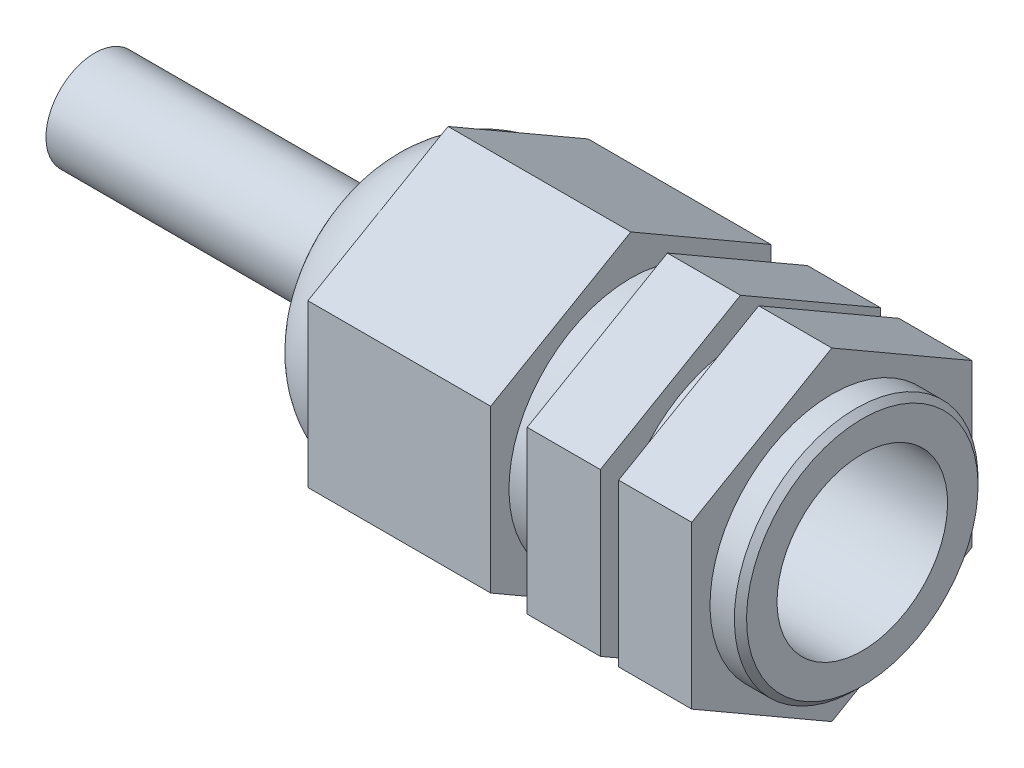
ISO-10303-21;
HEADER;
FILE_DESCRIPTION(('STEP AP214'),'2;1');
FILE_NAME('part.step','',(''),(''),'','','');
FILE_SCHEMA(('AUTOMOTIVE_DESIGN { 1 0 10303 214 1 1 1 1 }'));
ENDSEC;
DATA;
#1=APPLICATION_CONTEXT('core data for automotive mechanical design processes');
#2=APPLICATION_PROTOCOL_DEFINITION('international standard','automotive_design',2000,#1);
#3=PRODUCT_CONTEXT('',#1,'mechanical');
#4=PRODUCT('Part','Part','',(#3));
#5=PRODUCT_RELATED_PRODUCT_CATEGORY('part','',(#4));
#6=PRODUCT_DEFINITION_FORMATION('','',#4);
#7=PRODUCT_DEFINITION_CONTEXT('part definition',#1,'design');
#8=PRODUCT_DEFINITION('design','',#6,#7);
#9=PRODUCT_DEFINITION_SHAPE('','',#8);
#10=(LENGTH_UNIT() NAMED_UNIT(*) SI_UNIT(.MILLI.,.METRE.));
#11=(NAMED_UNIT(*) PLANE_ANGLE_UNIT() SI_UNIT($,.RADIAN.));
#12=(NAMED_UNIT(*) SI_UNIT($,.STERADIAN.) SOLID_ANGLE_UNIT());
#13=UNCERTAINTY_MEASURE_WITH_UNIT(LENGTH_MEASURE(1.E-05),#10,'distance_accuracy_value','');
#14=(GEOMETRIC_REPRESENTATION_CONTEXT(3) GLOBAL_UNCERTAINTY_ASSIGNED_CONTEXT((#13)) GLOBAL_UNIT_ASSIGNED_CONTEXT((#10,
#11,#12)) REPRESENTATION_CONTEXT('',''));
#15=CARTESIAN_POINT('',(0.,0.,0.));
#16=DIRECTION('',(0.,0.,1.));
#17=DIRECTION('',(1.,0.,0.));
#18=AXIS2_PLACEMENT_3D('',#15,#16,#17);
#19=CARTESIAN_POINT('',(-23.,0.,0.));
#20=DIRECTION('',(1.,0.,0.));
#21=DIRECTION('',(0.,1.,0.));
#22=AXIS2_PLACEMENT_3D('',#19,#20,#21);
#23=CYLINDRICAL_SURFACE('',#22,4.);
#24=CARTESIAN_POINT('',(-23.,0.,0.));
#25=DIRECTION('',(1.,0.,0.));
#26=DIRECTION('',(0.,1.,0.));
#27=AXIS2_PLACEMENT_3D('',#24,#25,#26);
#28=CIRCLE('',#27,4.);
#29=CARTESIAN_POINT('',(-23.,4.,0.));
#30=VERTEX_POINT('',#29);
#31=EDGE_CURVE('E11',#30,#30,#28,.T.);
#32=CARTESIAN_POINT('',(5.,0.,0.));
#33=DIRECTION('',(1.,0.,0.));
#34=DIRECTION('',(0.,1.,0.));
#35=AXIS2_PLACEMENT_3D('',#32,#33,#34);
#36=CIRCLE('',#35,4.);
#37=CARTESIAN_POINT('',(5.,4.,0.));
#38=VERTEX_POINT('',#37);
#39=EDGE_CURVE('E47',#38,#38,#36,.T.);
#40=CARTESIAN_POINT('',(-23.,4.,0.));
#41=CARTESIAN_POINT('',(-22.7083333333333,4.,0.));
#42=CARTESIAN_POINT('',(-22.4166666666667,4.,0.));
#43=CARTESIAN_POINT('',(-21.8333333333333,4.,0.));
#44=CARTESIAN_POINT('',(-21.5416666666667,4.,0.));
#45=CARTESIAN_POINT('',(-20.9583333333333,4.,0.));
#46=CARTESIAN_POINT('',(-20.6666666666667,4.,0.));
#47=CARTESIAN_POINT('',(-20.0833333333333,4.,0.));
#48=CARTESIAN_POINT('',(-19.7916666666667,4.,0.));
#49=CARTESIAN_POINT('',(-19.2083333333333,4.,0.));
#50=CARTESIAN_POINT('',(-18.9166666666667,4.,0.));
#51=CARTESIAN_POINT('',(-18.3333333333333,4.,0.));
#52=CARTESIAN_POINT('',(-18.0416666666667,4.,0.));
#53=CARTESIAN_POINT('',(-17.4583333333333,4.,0.));
#54=CARTESIAN_POINT('',(-17.1666666666667,4.,0.));
#55=CARTESIAN_POINT('',(-16.5833333333333,4.,0.));
#56=CARTESIAN_POINT('',(-16.2916666666667,4.,0.));
#57=CARTESIAN_POINT('',(-15.7083333333333,4.,0.));
#58=CARTESIAN_POINT('',(-15.4166666666667,4.,0.));
#59=CARTESIAN_POINT('',(-14.8333333333333,4.,0.));
#60=CARTESIAN_POINT('',(-14.5416666666667,4.,0.));
#61=CARTESIAN_POINT('',(-13.9583333333333,4.,0.));
#62=CARTESIAN_POINT('',(-13.6666666666667,4.,0.));
#63=CARTESIAN_POINT('',(-13.0833333333333,4.,0.));
#64=CARTESIAN_POINT('',(-12.7916666666667,4.,0.));
#65=CARTESIAN_POINT('',(-12.2083333333333,4.,0.));
#66=CARTESIAN_POINT('',(-11.9166666666667,4.,0.));
#67=CARTESIAN_POINT('',(-11.3333333333333,4.,0.));
#68=CARTESIAN_POINT('',(-11.0416666666667,4.,0.));
#69=CARTESIAN_POINT('',(-10.4583333333333,4.,0.));
#70=CARTESIAN_POINT('',(-10.1666666666667,4.,0.));
#71=CARTESIAN_POINT('',(-9.58333333333333,4.,0.));
#72=CARTESIAN_POINT('',(-9.29166666666666,4.,0.));
#73=CARTESIAN_POINT('',(-8.70833333333333,4.,0.));
#74=CARTESIAN_POINT('',(-8.41666666666666,4.,0.));
#75=CARTESIAN_POINT('',(-7.83333333333333,4.,0.));
#76=CARTESIAN_POINT('',(-7.54166666666667,4.,0.));
#77=CARTESIAN_POINT('',(-6.95833333333333,4.,0.));
#78=CARTESIAN_POINT('',(-6.66666666666667,4.,0.));
#79=CARTESIAN_POINT('',(-6.08333333333334,4.,0.));
#80=CARTESIAN_POINT('',(-5.79166666666667,4.,0.));
#81=CARTESIAN_POINT('',(-5.20833333333333,4.,0.));
#82=CARTESIAN_POINT('',(-4.91666666666667,4.,0.));
#83=CARTESIAN_POINT('',(-4.33333333333333,4.,0.));
#84=CARTESIAN_POINT('',(-4.04166666666667,4.,0.));
#85=CARTESIAN_POINT('',(-3.45833333333334,4.,0.));
#86=CARTESIAN_POINT('',(-3.16666666666667,4.,0.));
#87=CARTESIAN_POINT('',(-2.58333333333334,4.,0.));
#88=CARTESIAN_POINT('',(-2.29166666666667,4.,0.));
#89=CARTESIAN_POINT('',(-1.70833333333333,4.,0.));
#90=CARTESIAN_POINT('',(-1.41666666666667,4.,0.));
#91=CARTESIAN_POINT('',(-0.833333333333334,4.,0.));
#92=CARTESIAN_POINT('',(-0.541666666666667,4.,0.));
#93=CARTESIAN_POINT('',(0.0416666666666655,4.,0.));
#94=CARTESIAN_POINT('',(0.333333333333331,4.,0.));
#95=CARTESIAN_POINT('',(0.916666666666664,4.,0.));
#96=CARTESIAN_POINT('',(1.20833333333333,4.,0.));
#97=CARTESIAN_POINT('',(1.79166666666666,4.,0.));
#98=CARTESIAN_POINT('',(2.08333333333333,4.,0.));
#99=CARTESIAN_POINT('',(2.66666666666666,4.,0.));
#100=CARTESIAN_POINT('',(2.95833333333333,4.,0.));
#101=CARTESIAN_POINT('',(3.54166666666666,4.,0.));
#102=CARTESIAN_POINT('',(3.83333333333333,4.,0.));
#103=CARTESIAN_POINT('',(4.41666666666666,4.,0.));
#104=CARTESIAN_POINT('',(4.70833333333333,4.,0.));
#105=CARTESIAN_POINT('',(5.,4.,0.));
#106=B_SPLINE_CURVE_WITH_KNOTS('',3,(#40,#41,#42,#43,#44,#45,#46,#47,#48,#49,#50,#51,#52,#53,
#54,#55,#56,#57,#58,#59,#60,#61,#62,#63,#64,#65,#66,#67,#68,#69,#70,#71,#72,#73,#74,#75,#76,#77,
#78,#79,#80,#81,#82,#83,#84,#85,#86,#87,#88,#89,#90,#91,#92,#93,#94,#95,#96,#97,#98,#99,#100,
#101,#102,#103,#104,#105),.UNSPECIFIED.,.F.,.F.,(4,2,2,2,2,2,2,2,2,2,2,2,2,2,2,2,2,2,2,2,2,2,2,
2,2,2,2,2,2,2,2,2,4),(0.,0.875000000000001,1.75,2.625,3.5,4.375,5.25,6.125,7.,7.875,8.75,9.625,
10.5,11.375,12.25,13.125,14.,14.875,15.75,16.625,17.5,18.375,19.25,20.125,21.,21.875,22.75,
23.625,24.5,25.375,26.25,27.125,28.),.UNSPECIFIED.);
#107=EDGE_CURVE('BSEAM44',#30,#38,#106,.T.);
#108=ORIENTED_EDGE('',*,*,#31,.T.);
#109=ORIENTED_EDGE('',*,*,#39,.F.);
#110=ORIENTED_EDGE('',*,*,#107,.T.);
#111=ORIENTED_EDGE('',*,*,#107,.F.);
#112=EDGE_LOOP('',(#108,#110,#109,#111));
#113=FACE_BOUND('',#112,.T.);
#114=ADVANCED_FACE('F44',(#113),#23,.T.);
#115=CARTESIAN_POINT('',(-23.,0.,0.));
#116=DIRECTION('',(1.,0.,0.));
#117=DIRECTION('',(0.,1.,0.));
#118=AXIS2_PLACEMENT_3D('',#115,#116,#117);
#119=PLANE('',#118);
#120=ORIENTED_EDGE('',*,*,#31,.F.);
#121=EDGE_LOOP('',(#120));
#122=FACE_BOUND('',#121,.T.);
#123=ADVANCED_FACE('F59',(#122),#119,.F.);
#124=CARTESIAN_POINT('',(5.,0.,0.));
#125=DIRECTION('',(1.,0.,0.));
#126=DIRECTION('',(0.,1.,0.));
#127=AXIS2_PLACEMENT_3D('',#124,#125,#126);
#128=PLANE('',#127);
#129=ORIENTED_EDGE('',*,*,#39,.T.);
#130=EDGE_LOOP('',(#129));
#131=FACE_BOUND('',#130,.T.);
#132=ADVANCED_FACE('F56',(#131),#128,.T.);
#133=CLOSED_SHELL('',(#114,#123,#132));
#134=MANIFOLD_SOLID_BREP('B2',#133);
#135=CARTESIAN_POINT('',(37.5,13.2790561913614,0.));
#136=DIRECTION('',(1.,0.,0.));
#137=DIRECTION('',(0.,0.,-1.));
#138=AXIS2_PLACEMENT_3D('',#135,#136,#137);
#139=PLANE('',#138);
#140=DIRECTION('',(0.,0.5,0.866025403784439));
#141=VECTOR('',#140,1.);
#142=CARTESIAN_POINT('',(37.5,6.6395280956807,-11.5));
#143=LINE('',#142,#141);
#144=CARTESIAN_POINT('',(37.5,6.6395280956807,-11.5));
#145=VERTEX_POINT('',#144);
#146=CARTESIAN_POINT('',(37.5,13.2790561913614,0.));
#147=VERTEX_POINT('',#146);
#148=EDGE_CURVE('E189',#145,#147,#143,.T.);
#149=ORIENTED_EDGE('',*,*,#148,.T.);
#150=DIRECTION('',(0.,-0.500000000000001,0.866025403784438));
#151=VECTOR('',#150,1.);
#152=CARTESIAN_POINT('',(37.5,13.2790561913614,0.));
#153=LINE('',#152,#151);
#154=CARTESIAN_POINT('',(37.5,6.63952809568069,11.5));
#155=VERTEX_POINT('',#154);
#156=EDGE_CURVE('E147',#147,#155,#153,.T.);
#157=ORIENTED_EDGE('',*,*,#156,.T.);
#158=DIRECTION('',(0.,-1.,0.));
#159=VECTOR('',#158,1.);
#160=CARTESIAN_POINT('',(37.5,6.63952809568069,11.5));
#161=LINE('',#160,#159);
#162=CARTESIAN_POINT('',(37.5,-6.63952809568069,11.5));
#163=VERTEX_POINT('',#162);
#164=EDGE_CURVE('E160',#155,#163,#161,.T.);
#165=ORIENTED_EDGE('',*,*,#164,.T.);
#166=DIRECTION('',(0.,-0.5,-0.866025403784439));
#167=VECTOR('',#166,1.);
#168=CARTESIAN_POINT('',(37.5,-6.63952809568069,11.5));
#169=LINE('',#168,#167);
#170=CARTESIAN_POINT('',(37.5,-13.2790561913614,0.));
#171=VERTEX_POINT('',#170);
#172=EDGE_CURVE('E154',#163,#171,#169,.T.);
#173=ORIENTED_EDGE('',*,*,#172,.T.);
#174=DIRECTION('',(0.,0.5,-0.866025403784438));
#175=VECTOR('',#174,1.);
#176=CARTESIAN_POINT('',(37.5,-13.2790561913614,0.));
#177=LINE('',#176,#175);
#178=CARTESIAN_POINT('',(37.5,-6.63952809568069,-11.5));
#179=VERTEX_POINT('',#178);
#180=EDGE_CURVE('E158',#171,#179,#177,.T.);
#181=ORIENTED_EDGE('',*,*,#180,.T.);
#182=DIRECTION('',(0.,1.,0.));
#183=VECTOR('',#182,1.);
#184=CARTESIAN_POINT('',(37.5,-6.63952809568069,-11.5));
#185=LINE('',#184,#183);
#186=EDGE_CURVE('E110',#179,#145,#185,.T.);
#187=ORIENTED_EDGE('',*,*,#186,.T.);
#188=EDGE_LOOP('',(#149,#157,#165,#173,#181,#187));
#189=FACE_BOUND('',#188,.T.);
#190=CARTESIAN_POINT('',(37.5,0.,0.));
#191=DIRECTION('',(1.,0.,0.));
#192=DIRECTION('',(0.,1.,0.));
#193=AXIS2_PLACEMENT_3D('',#190,#191,#192);
#194=CIRCLE('',#193,9.99999999999999);
#195=CARTESIAN_POINT('',(37.5,9.99999999999999,0.));
#196=VERTEX_POINT('',#195);
#197=EDGE_CURVE('E182',#196,#196,#194,.T.);
#198=ORIENTED_EDGE('',*,*,#197,.F.);
#199=EDGE_LOOP('',(#198));
#200=FACE_BOUND('',#199,.T.);
#201=ADVANCED_FACE('F93',(#189,#200),#139,.T.);
#202=CARTESIAN_POINT('',(31.5,13.2790561913614,0.));
#203=DIRECTION('',(1.,0.,0.));
#204=DIRECTION('',(0.,0.,-1.));
#205=AXIS2_PLACEMENT_3D('',#202,#203,#204);
#206=PLANE('',#205);
#207=DIRECTION('',(0.,0.5,0.866025403784439));
#208=VECTOR('',#207,1.);
#209=CARTESIAN_POINT('',(31.5,6.6395280956807,-11.5));
#210=LINE('',#209,#208);
#211=CARTESIAN_POINT('',(31.5,6.6395280956807,-11.5));
#212=VERTEX_POINT('',#211);
#213=CARTESIAN_POINT('',(31.5,13.2790561913614,0.));
#214=VERTEX_POINT('',#213);
#215=EDGE_CURVE('E178',#212,#214,#210,.T.);
#216=ORIENTED_EDGE('',*,*,#215,.F.);
#217=DIRECTION('',(0.,1.,0.));
#218=VECTOR('',#217,1.);
#219=CARTESIAN_POINT('',(31.5,-6.63952809568069,-11.5));
#220=LINE('',#219,#218);
#221=CARTESIAN_POINT('',(31.5,-6.63952809568069,-11.5));
#222=VERTEX_POINT('',#221);
#223=EDGE_CURVE('E139',#222,#212,#220,.T.);
#224=ORIENTED_EDGE('',*,*,#223,.F.);
#225=DIRECTION('',(0.,0.5,-0.866025403784438));
#226=VECTOR('',#225,1.);
#227=CARTESIAN_POINT('',(31.5,-13.2790561913614,0.));
#228=LINE('',#227,#226);
#229=CARTESIAN_POINT('',(31.5,-13.2790561913614,0.));
#230=VERTEX_POINT('',#229);
#231=EDGE_CURVE('E133',#230,#222,#228,.T.);
#232=ORIENTED_EDGE('',*,*,#231,.F.);
#233=DIRECTION('',(0.,-0.5,-0.866025403784439));
#234=VECTOR('',#233,1.);
#235=CARTESIAN_POINT('',(31.5,-6.63952809568069,11.5));
#236=LINE('',#235,#234);
#237=CARTESIAN_POINT('',(31.5,-6.63952809568069,11.5));
#238=VERTEX_POINT('',#237);
#239=EDGE_CURVE('E168',#238,#230,#236,.T.);
#240=ORIENTED_EDGE('',*,*,#239,.F.);
#241=DIRECTION('',(0.,-1.,0.));
#242=VECTOR('',#241,1.);
#243=CARTESIAN_POINT('',(31.5,6.63952809568069,11.5));
#244=LINE('',#243,#242);
#245=CARTESIAN_POINT('',(31.5,6.63952809568069,11.5));
#246=VERTEX_POINT('',#245);
#247=EDGE_CURVE('E184',#246,#238,#244,.T.);
#248=ORIENTED_EDGE('',*,*,#247,.F.);
#249=DIRECTION('',(0.,-0.500000000000001,0.866025403784438));
#250=VECTOR('',#249,1.);
#251=CARTESIAN_POINT('',(31.5,13.2790561913614,0.));
#252=LINE('',#251,#250);
#253=EDGE_CURVE('E181',#214,#246,#252,.T.);
#254=ORIENTED_EDGE('',*,*,#253,.F.);
#255=EDGE_LOOP('',(#216,#224,#232,#240,#248,#254));
#256=FACE_BOUND('',#255,.T.);
#257=CARTESIAN_POINT('',(31.5,0.,0.));
#258=DIRECTION('',(1.,0.,0.));
#259=DIRECTION('',(0.,1.,0.));
#260=AXIS2_PLACEMENT_3D('',#257,#258,#259);
#261=CIRCLE('',#260,9.99999999999999);
#262=CARTESIAN_POINT('',(31.5,9.99999999999999,0.));
#263=VERTEX_POINT('',#262);
#264=EDGE_CURVE('E282',#263,#263,#261,.T.);
#265=ORIENTED_EDGE('',*,*,#264,.T.);
#266=EDGE_LOOP('',(#265));
#267=FACE_BOUND('',#266,.T.);
#268=ADVANCED_FACE('F198',(#256,#267),#206,.F.);
#269=CARTESIAN_POINT('',(37.5,6.6395280956807,-11.5));
#270=DIRECTION('',(0.,-0.866025403784439,0.5));
#271=DIRECTION('',(0.,-0.5,-0.866025403784439));
#272=AXIS2_PLACEMENT_3D('',#269,#270,#271);
#273=PLANE('',#272);
#274=ORIENTED_EDGE('',*,*,#215,.T.);
#275=DIRECTION('',(-1.,0.,0.));
#276=VECTOR('',#275,1.);
#277=CARTESIAN_POINT('',(37.5,13.2790561913614,0.));
#278=LINE('',#277,#276);
#279=EDGE_CURVE('E42',#147,#214,#278,.T.);
#280=ORIENTED_EDGE('',*,*,#279,.F.);
#281=ORIENTED_EDGE('',*,*,#148,.F.);
#282=DIRECTION('',(-1.,0.,0.));
#283=VECTOR('',#282,1.);
#284=CARTESIAN_POINT('',(37.5,6.6395280956807,-11.5));
#285=LINE('',#284,#283);
#286=EDGE_CURVE('E174',#145,#212,#285,.T.);
#287=ORIENTED_EDGE('',*,*,#286,.T.);
#288=EDGE_LOOP('',(#274,#280,#281,#287));
#289=FACE_BOUND('',#288,.T.);
#290=ADVANCED_FACE('F95',(#289),#273,.F.);
#291=CARTESIAN_POINT('',(37.5,13.2790561913614,0.));
#292=DIRECTION('',(0.,-0.866025403784438,-0.500000000000001));
#293=DIRECTION('',(0.,0.500000000000001,-0.866025403784438));
#294=AXIS2_PLACEMENT_3D('',#291,#292,#293);
#295=PLANE('',#294);
#296=ORIENTED_EDGE('',*,*,#253,.T.);
#297=DIRECTION('',(-1.,0.,0.));
#298=VECTOR('',#297,1.);
#299=CARTESIAN_POINT('',(37.5,6.63952809568069,11.5));
#300=LINE('',#299,#298);
#301=EDGE_CURVE('E102',#155,#246,#300,.T.);
#302=ORIENTED_EDGE('',*,*,#301,.F.);
#303=ORIENTED_EDGE('',*,*,#156,.F.);
#304=ORIENTED_EDGE('',*,*,#279,.T.);
#305=EDGE_LOOP('',(#296,#302,#303,#304));
#306=FACE_BOUND('',#305,.T.);
#307=ADVANCED_FACE('F223',(#306),#295,.F.);
#308=CARTESIAN_POINT('',(37.5,6.63952809568069,11.5));
#309=DIRECTION('',(0.,0.,-1.));
#310=DIRECTION('',(0.,1.,0.));
#311=AXIS2_PLACEMENT_3D('',#308,#309,#310);
#312=PLANE('',#311);
#313=ORIENTED_EDGE('',*,*,#247,.T.);
#314=DIRECTION('',(-1.,0.,0.));
#315=VECTOR('',#314,1.);
#316=CARTESIAN_POINT('',(37.5,-6.63952809568069,11.5));
#317=LINE('',#316,#315);
#318=EDGE_CURVE('E169',#163,#238,#317,.T.);
#319=ORIENTED_EDGE('',*,*,#318,.F.);
#320=ORIENTED_EDGE('',*,*,#164,.F.);
#321=ORIENTED_EDGE('',*,*,#301,.T.);
#322=EDGE_LOOP('',(#313,#319,#320,#321));
#323=FACE_BOUND('',#322,.T.);
#324=ADVANCED_FACE('F195',(#323),#312,.F.);
#325=CARTESIAN_POINT('',(37.5,-6.63952809568069,11.5));
#326=DIRECTION('',(0.,0.866025403784439,-0.5));
#327=DIRECTION('',(0.,0.5,0.866025403784439));
#328=AXIS2_PLACEMENT_3D('',#325,#326,#327);
#329=PLANE('',#328);
#330=ORIENTED_EDGE('',*,*,#239,.T.);
#331=DIRECTION('',(-1.,0.,0.));
#332=VECTOR('',#331,1.);
#333=CARTESIAN_POINT('',(37.5,-13.2790561913614,0.));
#334=LINE('',#333,#332);
#335=EDGE_CURVE('E165',#171,#230,#334,.T.);
#336=ORIENTED_EDGE('',*,*,#335,.F.);
#337=ORIENTED_EDGE('',*,*,#172,.F.);
#338=ORIENTED_EDGE('',*,*,#318,.T.);
#339=EDGE_LOOP('',(#330,#336,#337,#338));
#340=FACE_BOUND('',#339,.T.);
#341=ADVANCED_FACE('F166',(#340),#329,.F.);
#342=CARTESIAN_POINT('',(37.5,-13.2790561913614,0.));
#343=DIRECTION('',(0.,0.866025403784439,0.5));
#344=DIRECTION('',(0.,-0.5,0.866025403784439));
#345=AXIS2_PLACEMENT_3D('',#342,#343,#344);
#346=PLANE('',#345);
#347=ORIENTED_EDGE('',*,*,#231,.T.);
#348=DIRECTION('',(-1.,0.,0.));
#349=VECTOR('',#348,1.);
#350=CARTESIAN_POINT('',(37.5,-6.63952809568069,-11.5));
#351=LINE('',#350,#349);
#352=EDGE_CURVE('E170',#179,#222,#351,.T.);
#353=ORIENTED_EDGE('',*,*,#352,.F.);
#354=ORIENTED_EDGE('',*,*,#180,.F.);
#355=ORIENTED_EDGE('',*,*,#335,.T.);
#356=EDGE_LOOP('',(#347,#353,#354,#355));
#357=FACE_BOUND('',#356,.T.);
#358=ADVANCED_FACE('F172',(#357),#346,.F.);
#359=CARTESIAN_POINT('',(37.5,-6.63952809568069,-11.5));
#360=DIRECTION('',(0.,0.,1.));
#361=DIRECTION('',(1.,0.,0.));
#362=AXIS2_PLACEMENT_3D('',#359,#360,#361);
#363=PLANE('',#362);
#364=ORIENTED_EDGE('',*,*,#223,.T.);
#365=ORIENTED_EDGE('',*,*,#286,.F.);
#366=ORIENTED_EDGE('',*,*,#186,.F.);
#367=ORIENTED_EDGE('',*,*,#352,.T.);
#368=EDGE_LOOP('',(#364,#365,#366,#367));
#369=FACE_BOUND('',#368,.T.);
#370=ADVANCED_FACE('F203',(#369),#363,.F.);
#371=CARTESIAN_POINT('',(37.5,0.,0.));
#372=DIRECTION('',(-1.,0.,0.));
#373=DIRECTION('',(0.,-1.,0.));
#374=AXIS2_PLACEMENT_3D('',#371,#372,#373);
#375=CYLINDRICAL_SURFACE('',#374,9.99999999999999);
#376=ORIENTED_EDGE('',*,*,#197,.T.);
#377=EDGE_LOOP('',(#376));
#378=FACE_BOUND('',#377,.T.);
#379=ORIENTED_EDGE('',*,*,#264,.F.);
#380=EDGE_LOOP('',(#379));
#381=FACE_BOUND('',#380,.T.);
#382=ADVANCED_FACE('F205',(#378,#381),#375,.F.);
#383=CLOSED_SHELL('',(#201,#268,#290,#307,#324,#341,#358,#370,#382));
#384=MANIFOLD_SOLID_BREP('B6',#383);
#385=CARTESIAN_POINT('',(7.,0.,0.));
#386=DIRECTION('',(1.,0.,0.));
#387=DIRECTION('',(0.,1.,0.));
#388=AXIS2_PLACEMENT_3D('',#385,#386,#387);
#389=DEGENERATE_TOROIDAL_SURFACE('',#388,4.49999999999999,7.,.T.);
#390=CARTESIAN_POINT('',(0.,0.,0.));
#391=DIRECTION('',(1.,0.,0.));
#392=DIRECTION('',(0.,1.,0.));
#393=AXIS2_PLACEMENT_3D('',#390,#391,#392);
#394=CIRCLE('',#393,4.49999999999999);
#395=CARTESIAN_POINT('',(0.,4.49999999999999,0.));
#396=VERTEX_POINT('',#395);
#397=EDGE_CURVE('E407',#396,#396,#394,.T.);
#398=ORIENTED_EDGE('',*,*,#397,.T.);
#399=EDGE_LOOP('',(#398));
#400=FACE_BOUND('',#399,.T.);
#401=CARTESIAN_POINT('',(6.,0.,0.));
#402=DIRECTION('',(1.,0.,0.));
#403=DIRECTION('',(0.,0.,-1.));
#404=AXIS2_PLACEMENT_3D('',#401,#402,#403);
#405=CIRCLE('',#404,11.4282032302755);
#406=CARTESIAN_POINT('',(6.,0.,-11.4282032302755));
#407=VERTEX_POINT('',#406);
#408=EDGE_CURVE('E293',#407,#407,#405,.F.);
#409=ORIENTED_EDGE('',*,*,#408,.T.);
#410=EDGE_LOOP('',(#409));
#411=FACE_BOUND('',#410,.T.);
#412=ADVANCED_FACE('F289',(#400,#411),#389,.T.);
#413=CARTESIAN_POINT('',(5.,3.49999999999999,0.));
#414=DIRECTION('',(1.,0.,0.));
#415=DIRECTION('',(0.,1.,0.));
#416=AXIS2_PLACEMENT_3D('',#413,#414,#415);
#417=PLANE('',#416);
#418=CARTESIAN_POINT('',(5.,0.,0.));
#419=DIRECTION('',(1.,0.,0.));
#420=DIRECTION('',(0.,1.,0.));
#421=AXIS2_PLACEMENT_3D('',#418,#419,#420);
#422=CIRCLE('',#421,6.99999999999999);
#423=CARTESIAN_POINT('',(5.,6.99999999999999,0.));
#424=VERTEX_POINT('',#423);
#425=EDGE_CURVE('E422',#424,#424,#422,.T.);
#426=ORIENTED_EDGE('',*,*,#425,.T.);
#427=EDGE_LOOP('',(#426));
#428=FACE_BOUND('',#427,.T.);
#429=CARTESIAN_POINT('',(5.,0.,0.));
#430=DIRECTION('',(1.,0.,0.));
#431=DIRECTION('',(0.,1.,0.));
#432=AXIS2_PLACEMENT_3D('',#429,#430,#431);
#433=CIRCLE('',#432,3.49999999999999);
#434=CARTESIAN_POINT('',(5.,3.49999999999999,0.));
#435=VERTEX_POINT('',#434);
#436=EDGE_CURVE('E395',#435,#435,#433,.T.);
#437=ORIENTED_EDGE('',*,*,#436,.F.);
#438=EDGE_LOOP('',(#437));
#439=FACE_BOUND('',#438,.T.);
#440=ADVANCED_FACE('F446',(#428,#439),#417,.T.);
#441=CARTESIAN_POINT('',(72.2872595134608,0.,0.));
#442=DIRECTION('',(1.,0.,0.));
#443=DIRECTION('',(0.,1.,0.));
#444=AXIS2_PLACEMENT_3D('',#441,#442,#443);
#445=CYLINDRICAL_SURFACE('',#444,6.99999999999999);
#446=CARTESIAN_POINT('',(40.,0.,0.));
#447=DIRECTION('',(1.,0.,0.));
#448=DIRECTION('',(0.,1.,0.));
#449=AXIS2_PLACEMENT_3D('',#446,#447,#448);
#450=CIRCLE('',#449,6.99999999999999);
#451=CARTESIAN_POINT('',(40.,6.99999999999999,0.));
#452=VERTEX_POINT('',#451);
#453=EDGE_CURVE('E419',#452,#452,#450,.T.);
#454=ORIENTED_EDGE('',*,*,#453,.T.);
#455=EDGE_LOOP('',(#454));
#456=FACE_BOUND('',#455,.T.);
#457=ORIENTED_EDGE('',*,*,#425,.F.);
#458=EDGE_LOOP('',(#457));
#459=FACE_BOUND('',#458,.T.);
#460=ADVANCED_FACE('F452',(#456,#459),#445,.F.);
#461=CARTESIAN_POINT('',(40.,6.99999999999999,0.));
#462=DIRECTION('',(1.,0.,0.));
#463=DIRECTION('',(0.,1.,0.));
#464=AXIS2_PLACEMENT_3D('',#461,#462,#463);
#465=PLANE('',#464);
#466=CARTESIAN_POINT('',(40.,0.,0.));
#467=DIRECTION('',(1.,0.,0.));
#468=DIRECTION('',(0.,1.,0.));
#469=AXIS2_PLACEMENT_3D('',#466,#467,#468);
#470=CIRCLE('',#469,9.5);
#471=CARTESIAN_POINT('',(40.,9.5,0.));
#472=VERTEX_POINT('',#471);
#473=EDGE_CURVE('E299',#472,#472,#470,.T.);
#474=ORIENTED_EDGE('',*,*,#473,.T.);
#475=EDGE_LOOP('',(#474));
#476=FACE_BOUND('',#475,.T.);
#477=ORIENTED_EDGE('',*,*,#453,.F.);
#478=EDGE_LOOP('',(#477));
#479=FACE_BOUND('',#478,.T.);
#480=ADVANCED_FACE('F428',(#476,#479),#465,.T.);
#481=CARTESIAN_POINT('',(72.2872595134608,0.,0.));
#482=DIRECTION('',(1.,0.,0.));
#483=DIRECTION('',(0.,1.,0.));
#484=AXIS2_PLACEMENT_3D('',#481,#482,#483);
#485=CYLINDRICAL_SURFACE('',#484,9.99999999999999);
#486=CARTESIAN_POINT('',(39.5,0.,0.));
#487=DIRECTION('',(1.,0.,0.));
#488=DIRECTION('',(0.,1.,0.));
#489=AXIS2_PLACEMENT_3D('',#486,#487,#488);
#490=CIRCLE('',#489,9.99999999999999);
#491=CARTESIAN_POINT('',(39.5,9.99999999999999,0.));
#492=VERTEX_POINT('',#491);
#493=EDGE_CURVE('E91',#492,#492,#490,.F.);
#494=ORIENTED_EDGE('',*,*,#493,.T.);
#495=EDGE_LOOP('',(#494));
#496=FACE_BOUND('',#495,.T.);
#497=CARTESIAN_POINT('',(30.,0.,0.));
#498=DIRECTION('',(1.,0.,0.));
#499=DIRECTION('',(0.,1.,0.));
#500=AXIS2_PLACEMENT_3D('',#497,#498,#499);
#501=CIRCLE('',#500,9.99999999999999);
#502=CARTESIAN_POINT('',(30.,9.99999999999999,0.));
#503=VERTEX_POINT('',#502);
#504=EDGE_CURVE('E416',#503,#503,#501,.T.);
#505=ORIENTED_EDGE('',*,*,#504,.T.);
#506=EDGE_LOOP('',(#505));
#507=FACE_BOUND('',#506,.T.);
#508=ADVANCED_FACE('F471',(#496,#507),#485,.T.);
#509=CARTESIAN_POINT('',(30.,9.99999999999999,0.));
#510=DIRECTION('',(1.,0.,0.));
#511=DIRECTION('',(0.,1.,0.));
#512=AXIS2_PLACEMENT_3D('',#509,#510,#511);
#513=PLANE('',#512);
#514=DIRECTION('',(0.,0.5,0.866025403784439));
#515=VECTOR('',#514,1.);
#516=CARTESIAN_POINT('',(30.,6.6395280956807,-11.5));
#517=LINE('',#516,#515);
#518=CARTESIAN_POINT('',(30.,6.6395280956807,-11.5));
#519=VERTEX_POINT('',#518);
#520=CARTESIAN_POINT('',(30.,13.2790561913614,0.));
#521=VERTEX_POINT('',#520);
#522=EDGE_CURVE('E381',#519,#521,#517,.T.);
#523=ORIENTED_EDGE('',*,*,#522,.T.);
#524=DIRECTION('',(0.,-0.500000000000001,0.866025403784438));
#525=VECTOR('',#524,1.);
#526=CARTESIAN_POINT('',(30.,13.2790561913614,0.));
#527=LINE('',#526,#525);
#528=CARTESIAN_POINT('',(30.,6.63952809568069,11.5));
#529=VERTEX_POINT('',#528);
#530=EDGE_CURVE('E383',#521,#529,#527,.T.);
#531=ORIENTED_EDGE('',*,*,#530,.T.);
#532=DIRECTION('',(0.,-1.,0.));
#533=VECTOR('',#532,1.);
#534=CARTESIAN_POINT('',(30.,6.63952809568069,11.5));
#535=LINE('',#534,#533);
#536=CARTESIAN_POINT('',(30.,-6.63952809568069,11.5));
#537=VERTEX_POINT('',#536);
#538=EDGE_CURVE('E386',#529,#537,#535,.T.);
#539=ORIENTED_EDGE('',*,*,#538,.T.);
#540=DIRECTION('',(0.,-0.5,-0.866025403784439));
#541=VECTOR('',#540,1.);
#542=CARTESIAN_POINT('',(30.,-6.63952809568069,11.5));
#543=LINE('',#542,#541);
#544=CARTESIAN_POINT('',(30.,-13.2790561913614,0.));
#545=VERTEX_POINT('',#544);
#546=EDGE_CURVE('E389',#537,#545,#543,.T.);
#547=ORIENTED_EDGE('',*,*,#546,.T.);
#548=DIRECTION('',(0.,0.5,-0.866025403784438));
#549=VECTOR('',#548,1.);
#550=CARTESIAN_POINT('',(30.,-13.2790561913614,0.));
#551=LINE('',#550,#549);
#552=CARTESIAN_POINT('',(30.,-6.63952809568069,-11.5));
#553=VERTEX_POINT('',#552);
#554=EDGE_CURVE('E331',#545,#553,#551,.T.);
#555=ORIENTED_EDGE('',*,*,#554,.T.);
#556=DIRECTION('',(0.,1.,0.));
#557=VECTOR('',#556,1.);
#558=CARTESIAN_POINT('',(30.,-6.63952809568069,-11.5));
#559=LINE('',#558,#557);
#560=EDGE_CURVE('E336',#553,#519,#559,.T.);
#561=ORIENTED_EDGE('',*,*,#560,.T.);
#562=EDGE_LOOP('',(#523,#531,#539,#547,#555,#561));
#563=FACE_BOUND('',#562,.T.);
#564=ORIENTED_EDGE('',*,*,#504,.F.);
#565=EDGE_LOOP('',(#564));
#566=FACE_BOUND('',#565,.T.);
#567=ADVANCED_FACE('F467',(#563,#566),#513,.T.);
#568=CARTESIAN_POINT('',(24.,11.5,0.));
#569=DIRECTION('',(-1.,0.,0.));
#570=DIRECTION('',(0.,-1.,0.));
#571=AXIS2_PLACEMENT_3D('',#568,#569,#570);
#572=PLANE('',#571);
#573=CARTESIAN_POINT('',(24.,0.,0.));
#574=DIRECTION('',(1.,0.,0.));
#575=DIRECTION('',(0.,1.,0.));
#576=AXIS2_PLACEMENT_3D('',#573,#574,#575);
#577=CIRCLE('',#576,9.99999999999999);
#578=CARTESIAN_POINT('',(24.,9.99999999999999,0.));
#579=VERTEX_POINT('',#578);
#580=EDGE_CURVE('E413',#579,#579,#577,.T.);
#581=ORIENTED_EDGE('',*,*,#580,.T.);
#582=EDGE_LOOP('',(#581));
#583=FACE_BOUND('',#582,.T.);
#584=DIRECTION('',(0.,0.5,0.866025403784439));
#585=VECTOR('',#584,1.);
#586=CARTESIAN_POINT('',(24.,6.6395280956807,-11.5));
#587=LINE('',#586,#585);
#588=CARTESIAN_POINT('',(24.,6.6395280956807,-11.5));
#589=VERTEX_POINT('',#588);
#590=CARTESIAN_POINT('',(24.,13.2790561913614,0.));
#591=VERTEX_POINT('',#590);
#592=EDGE_CURVE('E344',#589,#591,#587,.T.);
#593=ORIENTED_EDGE('',*,*,#592,.F.);
#594=DIRECTION('',(0.,1.,0.));
#595=VECTOR('',#594,1.);
#596=CARTESIAN_POINT('',(24.,-6.63952809568069,-11.5));
#597=LINE('',#596,#595);
#598=CARTESIAN_POINT('',(24.,-6.63952809568069,-11.5));
#599=VERTEX_POINT('',#598);
#600=EDGE_CURVE('E307',#599,#589,#597,.T.);
#601=ORIENTED_EDGE('',*,*,#600,.F.);
#602=DIRECTION('',(0.,0.5,-0.866025403784438));
#603=VECTOR('',#602,1.);
#604=CARTESIAN_POINT('',(24.,-13.2790561913614,0.));
#605=LINE('',#604,#603);
#606=CARTESIAN_POINT('',(24.,-13.2790561913614,0.));
#607=VERTEX_POINT('',#606);
#608=EDGE_CURVE('E368',#607,#599,#605,.T.);
#609=ORIENTED_EDGE('',*,*,#608,.F.);
#610=DIRECTION('',(0.,-0.5,-0.866025403784439));
#611=VECTOR('',#610,1.);
#612=CARTESIAN_POINT('',(24.,-6.63952809568069,11.5));
#613=LINE('',#612,#611);
#614=CARTESIAN_POINT('',(24.,-6.63952809568069,11.5));
#615=VERTEX_POINT('',#614);
#616=EDGE_CURVE('E359',#615,#607,#613,.T.);
#617=ORIENTED_EDGE('',*,*,#616,.F.);
#618=DIRECTION('',(0.,-1.,0.));
#619=VECTOR('',#618,1.);
#620=CARTESIAN_POINT('',(24.,6.63952809568069,11.5));
#621=LINE('',#620,#619);
#622=CARTESIAN_POINT('',(24.,6.63952809568069,11.5));
#623=VERTEX_POINT('',#622);
#624=EDGE_CURVE('E369',#623,#615,#621,.T.);
#625=ORIENTED_EDGE('',*,*,#624,.F.);
#626=DIRECTION('',(0.,-0.500000000000001,0.866025403784438));
#627=VECTOR('',#626,1.);
#628=CARTESIAN_POINT('',(24.,13.2790561913614,0.));
#629=LINE('',#628,#627);
#630=EDGE_CURVE('E730',#591,#623,#629,.T.);
#631=ORIENTED_EDGE('',*,*,#630,.F.);
#632=EDGE_LOOP('',(#593,#601,#609,#617,#625,#631));
#633=FACE_BOUND('',#632,.T.);
#634=ADVANCED_FACE('F375',(#583,#633),#572,.T.);
#635=CARTESIAN_POINT('',(72.2872595134608,0.,0.));
#636=DIRECTION('',(1.,0.,0.));
#637=DIRECTION('',(0.,1.,0.));
#638=AXIS2_PLACEMENT_3D('',#635,#636,#637);
#639=CYLINDRICAL_SURFACE('',#638,9.99999999999999);
#640=CARTESIAN_POINT('',(21.,0.,0.));
#641=DIRECTION('',(1.,0.,0.));
#642=DIRECTION('',(0.,1.,0.));
#643=AXIS2_PLACEMENT_3D('',#640,#641,#642);
#644=CIRCLE('',#643,9.99999999999999);
#645=CARTESIAN_POINT('',(21.,9.99999999999999,0.));
#646=VERTEX_POINT('',#645);
#647=EDGE_CURVE('E410',#646,#646,#644,.T.);
#648=ORIENTED_EDGE('',*,*,#647,.T.);
#649=EDGE_LOOP('',(#648));
#650=FACE_BOUND('',#649,.T.);
#651=ORIENTED_EDGE('',*,*,#580,.F.);
#652=EDGE_LOOP('',(#651));
#653=FACE_BOUND('',#652,.T.);
#654=ADVANCED_FACE('F460',(#650,#653),#639,.T.);
#655=CARTESIAN_POINT('',(21.,9.99999999999999,0.));
#656=DIRECTION('',(1.,0.,0.));
#657=DIRECTION('',(0.,1.,0.));
#658=AXIS2_PLACEMENT_3D('',#655,#656,#657);
#659=PLANE('',#658);
#660=DIRECTION('',(0.,0.5,0.866025403784439));
#661=VECTOR('',#660,1.);
#662=CARTESIAN_POINT('',(21.,6.6395280956807,-11.5));
#663=LINE('',#662,#661);
#664=CARTESIAN_POINT('',(21.,6.6395280956807,-11.5));
#665=VERTEX_POINT('',#664);
#666=CARTESIAN_POINT('',(21.,13.2790561913614,0.));
#667=VERTEX_POINT('',#666);
#668=EDGE_CURVE('E702',#665,#667,#663,.T.);
#669=ORIENTED_EDGE('',*,*,#668,.T.);
#670=DIRECTION('',(0.,-0.500000000000001,0.866025403784438));
#671=VECTOR('',#670,1.);
#672=CARTESIAN_POINT('',(21.,13.2790561913614,0.));
#673=LINE('',#672,#671);
#674=CARTESIAN_POINT('',(21.,6.63952809568069,11.5));
#675=VERTEX_POINT('',#674);
#676=EDGE_CURVE('E705',#667,#675,#673,.T.);
#677=ORIENTED_EDGE('',*,*,#676,.T.);
#678=DIRECTION('',(0.,-1.,0.));
#679=VECTOR('',#678,1.);
#680=CARTESIAN_POINT('',(21.,6.63952809568069,11.5));
#681=LINE('',#680,#679);
#682=CARTESIAN_POINT('',(21.,-6.63952809568069,11.5));
#683=VERTEX_POINT('',#682);
#684=EDGE_CURVE('E708',#675,#683,#681,.T.);
#685=ORIENTED_EDGE('',*,*,#684,.T.);
#686=DIRECTION('',(0.,-0.5,-0.866025403784439));
#687=VECTOR('',#686,1.);
#688=CARTESIAN_POINT('',(21.,-6.63952809568069,11.5));
#689=LINE('',#688,#687);
#690=CARTESIAN_POINT('',(21.,-13.2790561913614,0.));
#691=VERTEX_POINT('',#690);
#692=EDGE_CURVE('E711',#683,#691,#689,.T.);
#693=ORIENTED_EDGE('',*,*,#692,.T.);
#694=DIRECTION('',(0.,0.5,-0.866025403784438));
#695=VECTOR('',#694,1.);
#696=CARTESIAN_POINT('',(21.,-13.2790561913614,0.));
#697=LINE('',#696,#695);
#698=CARTESIAN_POINT('',(21.,-6.63952809568069,-11.5));
#699=VERTEX_POINT('',#698);
#700=EDGE_CURVE('E714',#691,#699,#697,.T.);
#701=ORIENTED_EDGE('',*,*,#700,.T.);
#702=DIRECTION('',(0.,1.,0.));
#703=VECTOR('',#702,1.);
#704=CARTESIAN_POINT('',(21.,-6.63952809568069,-11.5));
#705=LINE('',#704,#703);
#706=EDGE_CURVE('E684',#699,#665,#705,.T.);
#707=ORIENTED_EDGE('',*,*,#706,.T.);
#708=EDGE_LOOP('',(#669,#677,#685,#693,#701,#707));
#709=FACE_BOUND('',#708,.T.);
#710=ORIENTED_EDGE('',*,*,#647,.F.);
#711=EDGE_LOOP('',(#710));
#712=FACE_BOUND('',#711,.T.);
#713=ADVANCED_FACE('F457',(#709,#712),#659,.T.);
#714=CARTESIAN_POINT('',(0.,4.49999999999999,0.));
#715=DIRECTION('',(-1.,0.,0.));
#716=DIRECTION('',(0.,-1.,0.));
#717=AXIS2_PLACEMENT_3D('',#714,#715,#716);
#718=PLANE('',#717);
#719=CARTESIAN_POINT('',(0.,0.,0.));
#720=DIRECTION('',(1.,0.,0.));
#721=DIRECTION('',(0.,1.,0.));
#722=AXIS2_PLACEMENT_3D('',#719,#720,#721);
#723=CIRCLE('',#722,3.49999999999999);
#724=CARTESIAN_POINT('',(0.,3.49999999999999,0.));
#725=VERTEX_POINT('',#724);
#726=EDGE_CURVE('E404',#725,#725,#723,.T.);
#727=ORIENTED_EDGE('',*,*,#726,.T.);
#728=EDGE_LOOP('',(#727));
#729=FACE_BOUND('',#728,.T.);
#730=ORIENTED_EDGE('',*,*,#397,.F.);
#731=EDGE_LOOP('',(#730));
#732=FACE_BOUND('',#731,.T.);
#733=ADVANCED_FACE('F441',(#729,#732),#718,.T.);
#734=CARTESIAN_POINT('',(72.2872595134608,0.,0.));
#735=DIRECTION('',(1.,0.,0.));
#736=DIRECTION('',(0.,1.,0.));
#737=AXIS2_PLACEMENT_3D('',#734,#735,#736);
#738=CYLINDRICAL_SURFACE('',#737,3.49999999999999);
#739=ORIENTED_EDGE('',*,*,#436,.T.);
#740=EDGE_LOOP('',(#739));
#741=FACE_BOUND('',#740,.T.);
#742=ORIENTED_EDGE('',*,*,#726,.F.);
#743=EDGE_LOOP('',(#742));
#744=FACE_BOUND('',#743,.T.);
#745=ADVANCED_FACE('F433',(#741,#744),#738,.F.);
#746=CARTESIAN_POINT('',(40.,0.,0.));
#747=DIRECTION('',(-1.,0.,0.));
#748=DIRECTION('',(0.,-1.,0.));
#749=AXIS2_PLACEMENT_3D('',#746,#747,#748);
#750=CONICAL_SURFACE('',#749,9.5,0.785398163397448);
#751=ORIENTED_EDGE('',*,*,#493,.F.);
#752=EDGE_LOOP('',(#751));
#753=FACE_BOUND('',#752,.T.);
#754=ORIENTED_EDGE('',*,*,#473,.F.);
#755=EDGE_LOOP('',(#754));
#756=FACE_BOUND('',#755,.T.);
#757=ADVANCED_FACE('F291',(#753,#756),#750,.T.);
#758=CARTESIAN_POINT('',(24.,6.6395280956807,-11.5));
#759=DIRECTION('',(0.,0.866025403784439,-0.5));
#760=DIRECTION('',(0.,0.5,0.866025403784439));
#761=AXIS2_PLACEMENT_3D('',#758,#759,#760);
#762=PLANE('',#761);
#763=ORIENTED_EDGE('',*,*,#592,.T.);
#764=DIRECTION('',(1.,0.,0.));
#765=VECTOR('',#764,1.);
#766=CARTESIAN_POINT('',(24.,13.2790561913614,0.));
#767=LINE('',#766,#765);
#768=EDGE_CURVE('E377',#591,#521,#767,.T.);
#769=ORIENTED_EDGE('',*,*,#768,.T.);
#770=ORIENTED_EDGE('',*,*,#522,.F.);
#771=DIRECTION('',(1.,0.,0.));
#772=VECTOR('',#771,1.);
#773=CARTESIAN_POINT('',(24.,6.6395280956807,-11.5));
#774=LINE('',#773,#772);
#775=EDGE_CURVE('E393',#589,#519,#774,.T.);
#776=ORIENTED_EDGE('',*,*,#775,.F.);
#777=EDGE_LOOP('',(#763,#769,#770,#776));
#778=FACE_BOUND('',#777,.T.);
#779=ADVANCED_FACE('F432',(#778),#762,.T.);
#780=CARTESIAN_POINT('',(24.,-6.63952809568069,-11.5));
#781=DIRECTION('',(0.,0.,-1.));
#782=DIRECTION('',(-1.,0.,0.));
#783=AXIS2_PLACEMENT_3D('',#780,#781,#782);
#784=PLANE('',#783);
#785=ORIENTED_EDGE('',*,*,#600,.T.);
#786=ORIENTED_EDGE('',*,*,#775,.T.);
#787=ORIENTED_EDGE('',*,*,#560,.F.);
#788=DIRECTION('',(1.,0.,0.));
#789=VECTOR('',#788,1.);
#790=CARTESIAN_POINT('',(24.,-6.63952809568069,-11.5));
#791=LINE('',#790,#789);
#792=EDGE_CURVE('E373',#599,#553,#791,.T.);
#793=ORIENTED_EDGE('',*,*,#792,.F.);
#794=EDGE_LOOP('',(#785,#786,#787,#793));
#795=FACE_BOUND('',#794,.T.);
#796=ADVANCED_FACE('F439',(#795),#784,.T.);
#797=CARTESIAN_POINT('',(24.,-13.2790561913614,0.));
#798=DIRECTION('',(0.,-0.866025403784439,-0.5));
#799=DIRECTION('',(0.,0.5,-0.866025403784439));
#800=AXIS2_PLACEMENT_3D('',#797,#798,#799);
#801=PLANE('',#800);
#802=ORIENTED_EDGE('',*,*,#608,.T.);
#803=ORIENTED_EDGE('',*,*,#792,.T.);
#804=ORIENTED_EDGE('',*,*,#554,.F.);
#805=DIRECTION('',(1.,0.,0.));
#806=VECTOR('',#805,1.);
#807=CARTESIAN_POINT('',(24.,-13.2790561913614,0.));
#808=LINE('',#807,#806);
#809=EDGE_CURVE('E362',#607,#545,#808,.T.);
#810=ORIENTED_EDGE('',*,*,#809,.F.);
#811=EDGE_LOOP('',(#802,#803,#804,#810));
#812=FACE_BOUND('',#811,.T.);
#813=ADVANCED_FACE('F372',(#812),#801,.T.);
#814=CARTESIAN_POINT('',(24.,-6.63952809568069,11.5));
#815=DIRECTION('',(0.,-0.866025403784439,0.5));
#816=DIRECTION('',(0.,-0.5,-0.866025403784439));
#817=AXIS2_PLACEMENT_3D('',#814,#815,#816);
#818=PLANE('',#817);
#819=ORIENTED_EDGE('',*,*,#616,.T.);
#820=ORIENTED_EDGE('',*,*,#809,.T.);
#821=ORIENTED_EDGE('',*,*,#546,.F.);
#822=DIRECTION('',(1.,0.,0.));
#823=VECTOR('',#822,1.);
#824=CARTESIAN_POINT('',(24.,-6.63952809568069,11.5));
#825=LINE('',#824,#823);
#826=EDGE_CURVE('E364',#615,#537,#825,.T.);
#827=ORIENTED_EDGE('',*,*,#826,.F.);
#828=EDGE_LOOP('',(#819,#820,#821,#827));
#829=FACE_BOUND('',#828,.T.);
#830=ADVANCED_FACE('F361',(#829),#818,.T.);
#831=CARTESIAN_POINT('',(24.,6.63952809568069,11.5));
#832=DIRECTION('',(0.,0.,1.));
#833=DIRECTION('',(0.,-1.,0.));
#834=AXIS2_PLACEMENT_3D('',#831,#832,#833);
#835=PLANE('',#834);
#836=ORIENTED_EDGE('',*,*,#624,.T.);
#837=ORIENTED_EDGE('',*,*,#826,.T.);
#838=ORIENTED_EDGE('',*,*,#538,.F.);
#839=DIRECTION('',(1.,0.,0.));
#840=VECTOR('',#839,1.);
#841=CARTESIAN_POINT('',(24.,6.63952809568069,11.5));
#842=LINE('',#841,#840);
#843=EDGE_CURVE('E398',#623,#529,#842,.T.);
#844=ORIENTED_EDGE('',*,*,#843,.F.);
#845=EDGE_LOOP('',(#836,#837,#838,#844));
#846=FACE_BOUND('',#845,.T.);
#847=ADVANCED_FACE('F563',(#846),#835,.T.);
#848=CARTESIAN_POINT('',(24.,13.2790561913614,0.));
#849=DIRECTION('',(0.,0.866025403784438,0.500000000000001));
#850=DIRECTION('',(0.,-0.500000000000001,0.866025403784438));
#851=AXIS2_PLACEMENT_3D('',#848,#849,#850);
#852=PLANE('',#851);
#853=ORIENTED_EDGE('',*,*,#630,.T.);
#854=ORIENTED_EDGE('',*,*,#843,.T.);
#855=ORIENTED_EDGE('',*,*,#530,.F.);
#856=ORIENTED_EDGE('',*,*,#768,.F.);
#857=EDGE_LOOP('',(#853,#854,#855,#856));
#858=FACE_BOUND('',#857,.T.);
#859=ADVANCED_FACE('F572',(#858),#852,.T.);
#860=CARTESIAN_POINT('',(6.,6.6395280956807,-11.5));
#861=DIRECTION('',(0.,0.866025403784439,-0.5));
#862=DIRECTION('',(0.,0.5,0.866025403784439));
#863=AXIS2_PLACEMENT_3D('',#860,#861,#862);
#864=PLANE('',#863);
#865=ORIENTED_EDGE('',*,*,#668,.F.);
#866=DIRECTION('',(1.,0.,0.));
#867=VECTOR('',#866,1.);
#868=CARTESIAN_POINT('',(6.,6.6395280956807,-11.5));
#869=LINE('',#868,#867);
#870=CARTESIAN_POINT('',(6.,6.6395280956807,-11.5));
#871=VERTEX_POINT('',#870);
#872=EDGE_CURVE('E689',#871,#665,#869,.T.);
#873=ORIENTED_EDGE('',*,*,#872,.F.);
#874=DIRECTION('',(0.,0.5,0.866025403784439));
#875=VECTOR('',#874,1.);
#876=CARTESIAN_POINT('',(6.,6.6395280956807,-11.5));
#877=LINE('',#876,#875);
#878=CARTESIAN_POINT('',(6.,13.2790561913614,0.));
#879=VERTEX_POINT('',#878);
#880=EDGE_CURVE('E672',#871,#879,#877,.T.);
#881=ORIENTED_EDGE('',*,*,#880,.T.);
#882=DIRECTION('',(1.,0.,0.));
#883=VECTOR('',#882,1.);
#884=CARTESIAN_POINT('',(6.,13.2790561913614,0.));
#885=LINE('',#884,#883);
#886=EDGE_CURVE('E693',#879,#667,#885,.T.);
#887=ORIENTED_EDGE('',*,*,#886,.T.);
#888=EDGE_LOOP('',(#865,#873,#881,#887));
#889=FACE_BOUND('',#888,.T.);
#890=ADVANCED_FACE('F581',(#889),#864,.T.);
#891=CARTESIAN_POINT('',(6.,-6.63952809568069,-11.5));
#892=DIRECTION('',(0.,0.,-1.));
#893=DIRECTION('',(-1.,0.,0.));
#894=AXIS2_PLACEMENT_3D('',#891,#892,#893);
#895=PLANE('',#894);
#896=ORIENTED_EDGE('',*,*,#706,.F.);
#897=DIRECTION('',(1.,0.,0.));
#898=VECTOR('',#897,1.);
#899=CARTESIAN_POINT('',(6.,-6.63952809568069,-11.5));
#900=LINE('',#899,#898);
#901=CARTESIAN_POINT('',(6.,-6.63952809568069,-11.5));
#902=VERTEX_POINT('',#901);
#903=EDGE_CURVE('E691',#902,#699,#900,.T.);
#904=ORIENTED_EDGE('',*,*,#903,.F.);
#905=DIRECTION('',(0.,1.,0.));
#906=VECTOR('',#905,1.);
#907=CARTESIAN_POINT('',(6.,-6.63952809568069,-11.5));
#908=LINE('',#907,#906);
#909=EDGE_CURVE('E676',#902,#871,#908,.T.);
#910=ORIENTED_EDGE('',*,*,#909,.T.);
#911=ORIENTED_EDGE('',*,*,#872,.T.);
#912=EDGE_LOOP('',(#896,#904,#910,#911));
#913=FACE_BOUND('',#912,.T.);
#914=ADVANCED_FACE('F601',(#913),#895,.T.);
#915=CARTESIAN_POINT('',(6.,-13.2790561913614,0.));
#916=DIRECTION('',(0.,-0.866025403784439,-0.5));
#917=DIRECTION('',(0.,0.5,-0.866025403784439));
#918=AXIS2_PLACEMENT_3D('',#915,#916,#917);
#919=PLANE('',#918);
#920=ORIENTED_EDGE('',*,*,#700,.F.);
#921=DIRECTION('',(1.,0.,0.));
#922=VECTOR('',#921,1.);
#923=CARTESIAN_POINT('',(6.,-13.2790561913614,0.));
#924=LINE('',#923,#922);
#925=CARTESIAN_POINT('',(6.,-13.2790561913614,0.));
#926=VERTEX_POINT('',#925);
#927=EDGE_CURVE('E721',#926,#691,#924,.T.);
#928=ORIENTED_EDGE('',*,*,#927,.F.);
#929=DIRECTION('',(0.,0.5,-0.866025403784438));
#930=VECTOR('',#929,1.);
#931=CARTESIAN_POINT('',(6.,-13.2790561913614,0.));
#932=LINE('',#931,#930);
#933=EDGE_CURVE('E694',#926,#902,#932,.T.);
#934=ORIENTED_EDGE('',*,*,#933,.T.);
#935=ORIENTED_EDGE('',*,*,#903,.T.);
#936=EDGE_LOOP('',(#920,#928,#934,#935));
#937=FACE_BOUND('',#936,.T.);
#938=ADVANCED_FACE('F611',(#937),#919,.T.);
#939=CARTESIAN_POINT('',(6.,-6.63952809568069,11.5));
#940=DIRECTION('',(0.,-0.866025403784439,0.5));
#941=DIRECTION('',(0.,-0.5,-0.866025403784439));
#942=AXIS2_PLACEMENT_3D('',#939,#940,#941);
#943=PLANE('',#942);
#944=ORIENTED_EDGE('',*,*,#692,.F.);
#945=DIRECTION('',(1.,0.,0.));
#946=VECTOR('',#945,1.);
#947=CARTESIAN_POINT('',(6.,-6.63952809568069,11.5));
#948=LINE('',#947,#946);
#949=CARTESIAN_POINT('',(6.,-6.63952809568069,11.5));
#950=VERTEX_POINT('',#949);
#951=EDGE_CURVE('E724',#950,#683,#948,.T.);
#952=ORIENTED_EDGE('',*,*,#951,.F.);
#953=DIRECTION('',(0.,-0.5,-0.866025403784439));
#954=VECTOR('',#953,1.);
#955=CARTESIAN_POINT('',(6.,-6.63952809568069,11.5));
#956=LINE('',#955,#954);
#957=EDGE_CURVE('E698',#950,#926,#956,.T.);
#958=ORIENTED_EDGE('',*,*,#957,.T.);
#959=ORIENTED_EDGE('',*,*,#927,.T.);
#960=EDGE_LOOP('',(#944,#952,#958,#959));
#961=FACE_BOUND('',#960,.T.);
#962=ADVANCED_FACE('F621',(#961),#943,.T.);
#963=CARTESIAN_POINT('',(6.,6.63952809568069,11.5));
#964=DIRECTION('',(0.,0.,1.));
#965=DIRECTION('',(0.,-1.,0.));
#966=AXIS2_PLACEMENT_3D('',#963,#964,#965);
#967=PLANE('',#966);
#968=ORIENTED_EDGE('',*,*,#684,.F.);
#969=DIRECTION('',(1.,0.,0.));
#970=VECTOR('',#969,1.);
#971=CARTESIAN_POINT('',(6.,6.63952809568069,11.5));
#972=LINE('',#971,#970);
#973=CARTESIAN_POINT('',(6.,6.63952809568069,11.5));
#974=VERTEX_POINT('',#973);
#975=EDGE_CURVE('E696',#974,#675,#972,.T.);
#976=ORIENTED_EDGE('',*,*,#975,.F.);
#977=DIRECTION('',(0.,-1.,0.));
#978=VECTOR('',#977,1.);
#979=CARTESIAN_POINT('',(6.,6.63952809568069,11.5));
#980=LINE('',#979,#978);
#981=EDGE_CURVE('E747',#974,#950,#980,.T.);
#982=ORIENTED_EDGE('',*,*,#981,.T.);
#983=ORIENTED_EDGE('',*,*,#951,.T.);
#984=EDGE_LOOP('',(#968,#976,#982,#983));
#985=FACE_BOUND('',#984,.T.);
#986=ADVANCED_FACE('F631',(#985),#967,.T.);
#987=CARTESIAN_POINT('',(6.,13.2790561913614,0.));
#988=DIRECTION('',(0.,0.866025403784438,0.500000000000001));
#989=DIRECTION('',(0.,-0.500000000000001,0.866025403784438));
#990=AXIS2_PLACEMENT_3D('',#987,#988,#989);
#991=PLANE('',#990);
#992=ORIENTED_EDGE('',*,*,#676,.F.);
#993=ORIENTED_EDGE('',*,*,#886,.F.);
#994=DIRECTION('',(0.,-0.500000000000001,0.866025403784438));
#995=VECTOR('',#994,1.);
#996=CARTESIAN_POINT('',(6.,13.2790561913614,0.));
#997=LINE('',#996,#995);
#998=EDGE_CURVE('E680',#879,#974,#997,.T.);
#999=ORIENTED_EDGE('',*,*,#998,.T.);
#1000=ORIENTED_EDGE('',*,*,#975,.T.);
#1001=EDGE_LOOP('',(#992,#993,#999,#1000));
#1002=FACE_BOUND('',#1001,.T.);
#1003=ADVANCED_FACE('F641',(#1002),#991,.T.);
#1004=CARTESIAN_POINT('',(6.,13.2790561913614,0.));
#1005=DIRECTION('',(1.,0.,0.));
#1006=DIRECTION('',(0.,0.,-1.));
#1007=AXIS2_PLACEMENT_3D('',#1004,#1005,#1006);
#1008=PLANE('',#1007);
#1009=ORIENTED_EDGE('',*,*,#408,.F.);
#1010=EDGE_LOOP('',(#1009));
#1011=FACE_BOUND('',#1010,.T.);
#1012=ORIENTED_EDGE('',*,*,#880,.F.);
#1013=ORIENTED_EDGE('',*,*,#909,.F.);
#1014=ORIENTED_EDGE('',*,*,#933,.F.);
#1015=ORIENTED_EDGE('',*,*,#957,.F.);
#1016=ORIENTED_EDGE('',*,*,#981,.F.);
#1017=ORIENTED_EDGE('',*,*,#998,.F.);
#1018=EDGE_LOOP('',(#1012,#1013,#1014,#1015,#1016,#1017));
#1019=FACE_BOUND('',#1018,.T.);
#1020=ADVANCED_FACE('F651',(#1011,#1019),#1008,.F.);
#1021=CLOSED_SHELL('',(#412,#440,#460,#480,#508,#567,#634,#654,#713,#733,#745,#757,#779,#796,
#813,#830,#847,#859,#890,#914,#938,#962,#986,#1003,#1020));
#1022=MANIFOLD_SOLID_BREP('B36',#1021);
#1023=ADVANCED_BREP_SHAPE_REPRESENTATION('',(#18,#134,#384,#1022),#14);
#1024=SHAPE_DEFINITION_REPRESENTATION(#9,#1023);
ENDSEC;
END-ISO-10303-21;
